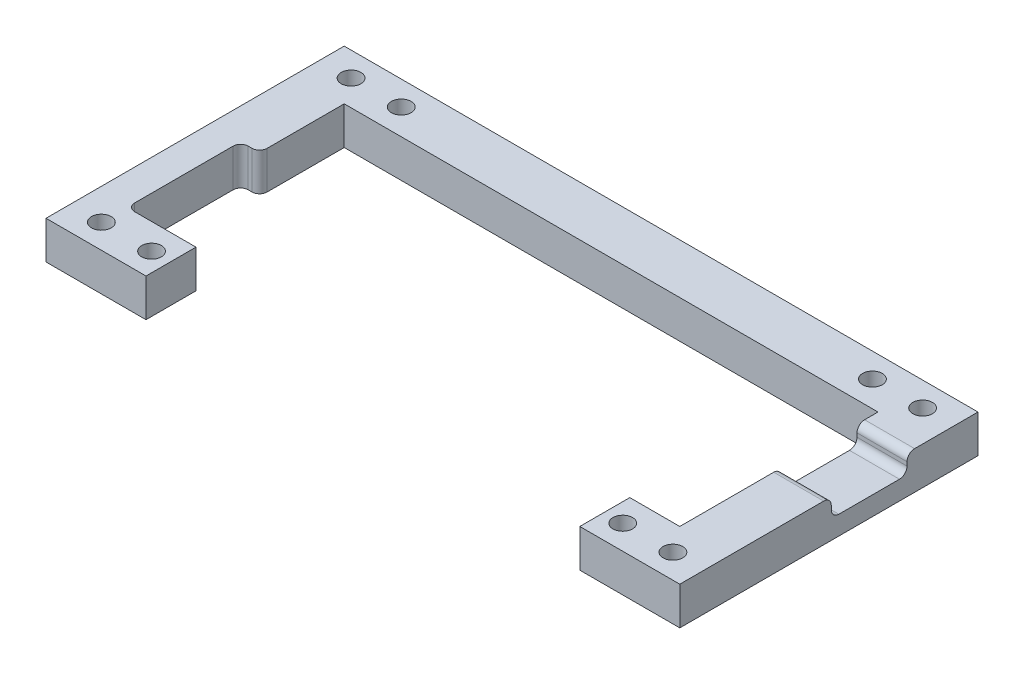
ISO-10303-21;
HEADER;
FILE_DESCRIPTION(('STEP AP214'),'2;1');
FILE_NAME('part.step','',(''),(''),'','','');
FILE_SCHEMA(('AUTOMOTIVE_DESIGN { 1 0 10303 214 1 1 1 1 }'));
ENDSEC;
DATA;
#1=APPLICATION_CONTEXT('core data for automotive mechanical design processes');
#2=APPLICATION_PROTOCOL_DEFINITION('international standard','automotive_design',2000,#1);
#3=PRODUCT_CONTEXT('',#1,'mechanical');
#4=PRODUCT('Part','Part','',(#3));
#5=PRODUCT_RELATED_PRODUCT_CATEGORY('part','',(#4));
#6=PRODUCT_DEFINITION_FORMATION('','',#4);
#7=PRODUCT_DEFINITION_CONTEXT('part definition',#1,'design');
#8=PRODUCT_DEFINITION('design','',#6,#7);
#9=PRODUCT_DEFINITION_SHAPE('','',#8);
#10=(LENGTH_UNIT() NAMED_UNIT(*) SI_UNIT(.MILLI.,.METRE.));
#11=(NAMED_UNIT(*) PLANE_ANGLE_UNIT() SI_UNIT($,.RADIAN.));
#12=(NAMED_UNIT(*) SI_UNIT($,.STERADIAN.) SOLID_ANGLE_UNIT());
#13=UNCERTAINTY_MEASURE_WITH_UNIT(LENGTH_MEASURE(1.E-05),#10,'distance_accuracy_value','');
#14=(GEOMETRIC_REPRESENTATION_CONTEXT(3) GLOBAL_UNCERTAINTY_ASSIGNED_CONTEXT((#13)) GLOBAL_UNIT_ASSIGNED_CONTEXT((#10,
#11,#12)) REPRESENTATION_CONTEXT('',''));
#15=CARTESIAN_POINT('',(0.,0.,0.));
#16=DIRECTION('',(0.,0.,1.));
#17=DIRECTION('',(1.,0.,0.));
#18=AXIS2_PLACEMENT_3D('',#15,#16,#17);
#19=CARTESIAN_POINT('',(173.037829353698,6.35,0.));
#20=DIRECTION('',(1.,0.,0.));
#21=DIRECTION('',(0.,0.,-1.));
#22=AXIS2_PLACEMENT_3D('',#19,#20,#21);
#23=PLANE('',#22);
#24=DIRECTION('',(0.,0.,1.));
#25=VECTOR('',#24,1.);
#26=CARTESIAN_POINT('',(173.037829353698,6.35,0.));
#27=LINE('',#26,#25);
#28=CARTESIAN_POINT('',(173.037829353698,6.35,-36.1278965517242));
#29=VERTEX_POINT('',#28);
#30=CARTESIAN_POINT('',(173.037829353698,6.35,-20.3798965517242));
#31=VERTEX_POINT('',#30);
#32=EDGE_CURVE('E348',#29,#31,#27,.T.);
#33=ORIENTED_EDGE('',*,*,#32,.F.);
#34=CARTESIAN_POINT('',(173.037829353698,5.08,-36.1278965517242));
#35=DIRECTION('',(1.,0.,0.));
#36=DIRECTION('',(0.,0.,-1.));
#37=AXIS2_PLACEMENT_3D('',#34,#35,#36);
#38=CIRCLE('',#37,1.27);
#39=CARTESIAN_POINT('',(173.037829353698,5.08,-37.3978965517242));
#40=VERTEX_POINT('',#39);
#41=EDGE_CURVE('E251',#29,#40,#38,.F.);
#42=ORIENTED_EDGE('',*,*,#41,.T.);
#43=DIRECTION('',(0.,-1.,0.));
#44=VECTOR('',#43,1.);
#45=CARTESIAN_POINT('',(173.037829353698,6.35,-37.3978965517242));
#46=LINE('',#45,#44);
#47=CARTESIAN_POINT('',(173.037829353698,4.445,-37.3978965517242));
#48=VERTEX_POINT('',#47);
#49=EDGE_CURVE('E329',#40,#48,#46,.T.);
#50=ORIENTED_EDGE('',*,*,#49,.T.);
#51=CARTESIAN_POINT('',(173.037829353698,4.445,-38.6678965517242));
#52=DIRECTION('',(1.,0.,0.));
#53=DIRECTION('',(0.,0.,-1.));
#54=AXIS2_PLACEMENT_3D('',#51,#52,#53);
#55=CIRCLE('',#54,1.27);
#56=CARTESIAN_POINT('',(173.037829353698,3.175,-38.6678965517242));
#57=VERTEX_POINT('',#56);
#58=EDGE_CURVE('E263',#48,#57,#55,.T.);
#59=ORIENTED_EDGE('',*,*,#58,.T.);
#60=DIRECTION('',(0.,0.,-1.));
#61=VECTOR('',#60,1.);
#62=CARTESIAN_POINT('',(173.037829353698,3.175,0.));
#63=LINE('',#62,#61);
#64=CARTESIAN_POINT('',(173.037829353698,3.175,-48.8278965517242));
#65=VERTEX_POINT('',#64);
#66=EDGE_CURVE('E335',#57,#65,#63,.T.);
#67=ORIENTED_EDGE('',*,*,#66,.T.);
#68=CARTESIAN_POINT('',(173.037829353698,4.445,-48.8278965517242));
#69=DIRECTION('',(1.,0.,0.));
#70=DIRECTION('',(0.,0.,-1.));
#71=AXIS2_PLACEMENT_3D('',#68,#69,#70);
#72=CIRCLE('',#71,1.27);
#73=CARTESIAN_POINT('',(173.037829353698,4.445,-50.0978965517242));
#74=VERTEX_POINT('',#73);
#75=EDGE_CURVE('E267',#65,#74,#72,.T.);
#76=ORIENTED_EDGE('',*,*,#75,.T.);
#77=DIRECTION('',(0.,-1.,0.));
#78=VECTOR('',#77,1.);
#79=CARTESIAN_POINT('',(173.037829353698,6.35,-50.0978965517242));
#80=LINE('',#79,#78);
#81=CARTESIAN_POINT('',(173.037829353698,5.08,-50.0978965517242));
#82=VERTEX_POINT('',#81);
#83=EDGE_CURVE('E332',#82,#74,#80,.T.);
#84=ORIENTED_EDGE('',*,*,#83,.F.);
#85=CARTESIAN_POINT('',(173.037829353698,5.08,-51.3678965517242));
#86=DIRECTION('',(1.,0.,0.));
#87=DIRECTION('',(0.,0.,-1.));
#88=AXIS2_PLACEMENT_3D('',#85,#86,#87);
#89=CIRCLE('',#88,1.27);
#90=CARTESIAN_POINT('',(173.037829353698,6.35,-51.3678965517242));
#91=VERTEX_POINT('',#90);
#92=EDGE_CURVE('E249',#82,#91,#89,.F.);
#93=ORIENTED_EDGE('',*,*,#92,.T.);
#94=CARTESIAN_POINT('',(173.037829353698,6.35,-53.6158965517242));
#95=VERTEX_POINT('',#94);
#96=EDGE_CURVE('E349',#95,#91,#27,.T.);
#97=ORIENTED_EDGE('',*,*,#96,.F.);
#98=DIRECTION('',(0.,-1.,0.));
#99=VECTOR('',#98,1.);
#100=CARTESIAN_POINT('',(173.037829353698,6.35,-53.6158965517242));
#101=LINE('',#100,#99);
#102=CARTESIAN_POINT('',(173.037829353698,0.,-53.6158965517242));
#103=VERTEX_POINT('',#102);
#104=EDGE_CURVE('E456',#95,#103,#101,.T.);
#105=ORIENTED_EDGE('',*,*,#104,.T.);
#106=DIRECTION('',(0.,0.,1.));
#107=VECTOR('',#106,1.);
#108=CARTESIAN_POINT('',(173.037829353698,0.,0.));
#109=LINE('',#108,#107);
#110=CARTESIAN_POINT('',(173.037829353698,0.,-20.3798965517242));
#111=VERTEX_POINT('',#110);
#112=EDGE_CURVE('E402',#103,#111,#109,.T.);
#113=ORIENTED_EDGE('',*,*,#112,.T.);
#114=DIRECTION('',(0.,-1.,0.));
#115=VECTOR('',#114,1.);
#116=CARTESIAN_POINT('',(173.037829353698,6.35,-20.3798965517242));
#117=LINE('',#116,#115);
#118=EDGE_CURVE('E453',#31,#111,#117,.T.);
#119=ORIENTED_EDGE('',*,*,#118,.F.);
#120=EDGE_LOOP('',(#33,#42,#50,#59,#67,#76,#84,#93,#97,#105,#113,#119));
#121=FACE_BOUND('',#120,.T.);
#122=ADVANCED_FACE('F35',(#121),#23,.F.);
#123=CARTESIAN_POINT('',(181.419829353698,6.35,-3.02124707508063E-13));
#124=DIRECTION('',(1.,0.,0.));
#125=DIRECTION('',(0.,0.,-1.));
#126=AXIS2_PLACEMENT_3D('',#123,#124,#125);
#127=PLANE('',#126);
#128=DIRECTION('',(0.,-1.,0.));
#129=VECTOR('',#128,1.);
#130=CARTESIAN_POINT('',(181.419829353698,6.35,-37.3978965517242));
#131=LINE('',#130,#129);
#132=CARTESIAN_POINT('',(181.419829353698,5.08,-37.3978965517242));
#133=VERTEX_POINT('',#132);
#134=CARTESIAN_POINT('',(181.419829353698,4.445,-37.3978965517242));
#135=VERTEX_POINT('',#134);
#136=EDGE_CURVE('E326',#133,#135,#131,.T.);
#137=ORIENTED_EDGE('',*,*,#136,.F.);
#138=CARTESIAN_POINT('',(181.419829353698,5.08,-36.1278965517242));
#139=DIRECTION('',(1.,0.,0.));
#140=DIRECTION('',(0.,0.,-1.));
#141=AXIS2_PLACEMENT_3D('',#138,#139,#140);
#142=CIRCLE('',#141,1.27);
#143=CARTESIAN_POINT('',(181.419829353698,6.35,-36.1278965517242));
#144=VERTEX_POINT('',#143);
#145=EDGE_CURVE('E245',#133,#144,#142,.T.);
#146=ORIENTED_EDGE('',*,*,#145,.T.);
#147=DIRECTION('',(0.,0.,1.));
#148=VECTOR('',#147,1.);
#149=CARTESIAN_POINT('',(181.419829353698,6.35,-3.02124707508063E-13));
#150=LINE('',#149,#148);
#151=CARTESIAN_POINT('',(181.419829353698,6.35,-11.9978965517242));
#152=VERTEX_POINT('',#151);
#153=EDGE_CURVE('E360',#144,#152,#150,.T.);
#154=ORIENTED_EDGE('',*,*,#153,.T.);
#155=DIRECTION('',(0.,-1.,0.));
#156=VECTOR('',#155,1.);
#157=CARTESIAN_POINT('',(181.419829353698,6.35,-11.9978965517242));
#158=LINE('',#157,#156);
#159=CARTESIAN_POINT('',(181.419829353698,0.,-11.9978965517242));
#160=VERTEX_POINT('',#159);
#161=EDGE_CURVE('E447',#152,#160,#158,.T.);
#162=ORIENTED_EDGE('',*,*,#161,.T.);
#163=DIRECTION('',(0.,0.,1.));
#164=VECTOR('',#163,1.);
#165=CARTESIAN_POINT('',(181.419829353698,0.,-3.02124707508063E-13));
#166=LINE('',#165,#164);
#167=CARTESIAN_POINT('',(181.419829353698,0.,-61.9978965517242));
#168=VERTEX_POINT('',#167);
#169=EDGE_CURVE('E413',#168,#160,#166,.T.);
#170=ORIENTED_EDGE('',*,*,#169,.F.);
#171=DIRECTION('',(0.,-1.,0.));
#172=VECTOR('',#171,1.);
#173=CARTESIAN_POINT('',(181.419829353698,6.35,-61.9978965517242));
#174=LINE('',#173,#172);
#175=CARTESIAN_POINT('',(181.419829353698,6.35,-61.9978965517242));
#176=VERTEX_POINT('',#175);
#177=EDGE_CURVE('E445',#176,#168,#174,.T.);
#178=ORIENTED_EDGE('',*,*,#177,.F.);
#179=CARTESIAN_POINT('',(181.419829353698,6.35,-51.3678965517242));
#180=VERTEX_POINT('',#179);
#181=EDGE_CURVE('E361',#176,#180,#150,.T.);
#182=ORIENTED_EDGE('',*,*,#181,.T.);
#183=CARTESIAN_POINT('',(181.419829353698,5.08,-51.3678965517242));
#184=DIRECTION('',(1.,0.,0.));
#185=DIRECTION('',(0.,0.,-1.));
#186=AXIS2_PLACEMENT_3D('',#183,#184,#185);
#187=CIRCLE('',#186,1.27);
#188=CARTESIAN_POINT('',(181.419829353698,5.08,-50.0978965517242));
#189=VERTEX_POINT('',#188);
#190=EDGE_CURVE('E243',#180,#189,#187,.T.);
#191=ORIENTED_EDGE('',*,*,#190,.T.);
#192=DIRECTION('',(0.,-1.,0.));
#193=VECTOR('',#192,1.);
#194=CARTESIAN_POINT('',(181.419829353698,6.35,-50.0978965517242));
#195=LINE('',#194,#193);
#196=CARTESIAN_POINT('',(181.419829353698,4.445,-50.0978965517242));
#197=VERTEX_POINT('',#196);
#198=EDGE_CURVE('E316',#189,#197,#195,.T.);
#199=ORIENTED_EDGE('',*,*,#198,.T.);
#200=CARTESIAN_POINT('',(181.419829353698,4.445,-48.8278965517242));
#201=DIRECTION('',(1.,0.,0.));
#202=DIRECTION('',(0.,0.,-1.));
#203=AXIS2_PLACEMENT_3D('',#200,#201,#202);
#204=CIRCLE('',#203,1.27);
#205=CARTESIAN_POINT('',(181.419829353698,3.175,-48.8278965517242));
#206=VERTEX_POINT('',#205);
#207=EDGE_CURVE('E265',#197,#206,#204,.F.);
#208=ORIENTED_EDGE('',*,*,#207,.T.);
#209=DIRECTION('',(0.,0.,-1.));
#210=VECTOR('',#209,1.);
#211=CARTESIAN_POINT('',(181.419829353698,3.175,-37.3978965517242));
#212=LINE('',#211,#210);
#213=CARTESIAN_POINT('',(181.419829353698,3.175,-38.6678965517242));
#214=VERTEX_POINT('',#213);
#215=EDGE_CURVE('E319',#214,#206,#212,.T.);
#216=ORIENTED_EDGE('',*,*,#215,.F.);
#217=CARTESIAN_POINT('',(181.419829353698,4.445,-38.6678965517242));
#218=DIRECTION('',(1.,0.,0.));
#219=DIRECTION('',(0.,0.,-1.));
#220=AXIS2_PLACEMENT_3D('',#217,#218,#219);
#221=CIRCLE('',#220,1.27);
#222=EDGE_CURVE('E261',#214,#135,#221,.F.);
#223=ORIENTED_EDGE('',*,*,#222,.T.);
#224=EDGE_LOOP('',(#137,#146,#154,#162,#170,#178,#182,#191,#199,#208,#216,#223));
#225=FACE_BOUND('',#224,.T.);
#226=ADVANCED_FACE('F491',(#225),#127,.T.);
#227=CARTESIAN_POINT('',(0.,6.35,0.));
#228=DIRECTION('',(0.,1.,0.));
#229=DIRECTION('',(0.,0.,1.));
#230=AXIS2_PLACEMENT_3D('',#227,#228,#229);
#231=PLANE('',#230);
#232=DIRECTION('',(-1.,0.,0.));
#233=VECTOR('',#232,1.);
#234=CARTESIAN_POINT('',(83.537177047282,6.35,-39.4298965517241));
#235=LINE('',#234,#233);
#236=CARTESIAN_POINT('',(82.267177047282,6.35,-39.4298965517241));
#237=VERTEX_POINT('',#236);
#238=CARTESIAN_POINT('',(81.632177047282,6.35,-39.4298965517241));
#239=VERTEX_POINT('',#238);
#240=EDGE_CURVE('E291',#237,#239,#235,.T.);
#241=ORIENTED_EDGE('',*,*,#240,.F.);
#242=CARTESIAN_POINT('',(82.267177047282,6.35,-40.6998965517241));
#243=DIRECTION('',(0.,1.,0.));
#244=DIRECTION('',(0.,0.,1.));
#245=AXIS2_PLACEMENT_3D('',#242,#243,#244);
#246=CIRCLE('',#245,1.27);
#247=CARTESIAN_POINT('',(83.537177047282,6.35,-40.6998965517241));
#248=VERTEX_POINT('',#247);
#249=EDGE_CURVE('E58',#237,#248,#246,.T.);
#250=ORIENTED_EDGE('',*,*,#249,.T.);
#251=DIRECTION('',(0.,0.,-1.));
#252=VECTOR('',#251,1.);
#253=CARTESIAN_POINT('',(83.537177047282,6.35,0.));
#254=LINE('',#253,#252);
#255=CARTESIAN_POINT('',(83.537177047282,6.35,-53.6158965517241));
#256=VERTEX_POINT('',#255);
#257=EDGE_CURVE('E343',#248,#256,#254,.T.);
#258=ORIENTED_EDGE('',*,*,#257,.T.);
#259=DIRECTION('',(-1.,0.,0.));
#260=VECTOR('',#259,1.);
#261=CARTESIAN_POINT('',(0.,6.35,-53.6158965517241));
#262=LINE('',#261,#260);
#263=EDGE_CURVE('E345',#95,#256,#262,.T.);
#264=ORIENTED_EDGE('',*,*,#263,.F.);
#265=ORIENTED_EDGE('',*,*,#96,.T.);
#266=DIRECTION('',(1.,0.,0.));
#267=VECTOR('',#266,1.);
#268=CARTESIAN_POINT('',(0.,6.35,-51.3678965517239));
#269=LINE('',#268,#267);
#270=EDGE_CURVE('E253',#91,#180,#269,.T.);
#271=ORIENTED_EDGE('',*,*,#270,.T.);
#272=ORIENTED_EDGE('',*,*,#181,.F.);
#273=DIRECTION('',(1.,0.,0.));
#274=VECTOR('',#273,1.);
#275=CARTESIAN_POINT('',(0.,6.35,-61.9978965517241));
#276=LINE('',#275,#274);
#277=CARTESIAN_POINT('',(75.155177047282,6.35,-61.9978965517241));
#278=VERTEX_POINT('',#277);
#279=EDGE_CURVE('E364',#278,#176,#276,.T.);
#280=ORIENTED_EDGE('',*,*,#279,.F.);
#281=DIRECTION('',(0.,0.,-1.));
#282=VECTOR('',#281,1.);
#283=CARTESIAN_POINT('',(75.155177047282,6.35,0.));
#284=LINE('',#283,#282);
#285=CARTESIAN_POINT('',(75.155177047282,6.35,-11.9978965517241));
#286=VERTEX_POINT('',#285);
#287=EDGE_CURVE('E221',#286,#278,#284,.T.);
#288=ORIENTED_EDGE('',*,*,#287,.F.);
#289=DIRECTION('',(1.,0.,0.));
#290=VECTOR('',#289,1.);
#291=CARTESIAN_POINT('',(0.,6.35,-11.9978965517241));
#292=LINE('',#291,#290);
#293=CARTESIAN_POINT('',(91.919177047282,6.35,-11.9978965517241));
#294=VERTEX_POINT('',#293);
#295=EDGE_CURVE('E213',#286,#294,#292,.T.);
#296=ORIENTED_EDGE('',*,*,#295,.T.);
#297=DIRECTION('',(0.,0.,-1.));
#298=VECTOR('',#297,1.);
#299=CARTESIAN_POINT('',(91.919177047282,6.35,0.));
#300=LINE('',#299,#298);
#301=CARTESIAN_POINT('',(91.919177047282,6.35,-20.3798965517241));
#302=VERTEX_POINT('',#301);
#303=EDGE_CURVE('E202',#294,#302,#300,.T.);
#304=ORIENTED_EDGE('',*,*,#303,.T.);
#305=DIRECTION('',(1.,0.,0.));
#306=VECTOR('',#305,1.);
#307=CARTESIAN_POINT('',(0.,6.35,-20.3798965517241));
#308=LINE('',#307,#306);
#309=CARTESIAN_POINT('',(81.632177047282,6.35,-20.3798965517241));
#310=VERTEX_POINT('',#309);
#311=EDGE_CURVE('E212',#310,#302,#308,.T.);
#312=ORIENTED_EDGE('',*,*,#311,.F.);
#313=CARTESIAN_POINT('',(81.632177047282,6.35,-21.6498965517241));
#314=DIRECTION('',(0.,1.,0.));
#315=DIRECTION('',(0.,0.,1.));
#316=AXIS2_PLACEMENT_3D('',#313,#314,#315);
#317=CIRCLE('',#316,1.27);
#318=CARTESIAN_POINT('',(80.362177047282,6.35,-21.6498965517241));
#319=VERTEX_POINT('',#318);
#320=EDGE_CURVE('E286',#310,#319,#317,.F.);
#321=ORIENTED_EDGE('',*,*,#320,.T.);
#322=DIRECTION('',(0.,0.,1.));
#323=VECTOR('',#322,1.);
#324=CARTESIAN_POINT('',(80.362177047282,6.35,-20.3798965517241));
#325=LINE('',#324,#323);
#326=CARTESIAN_POINT('',(80.362177047282,6.35,-38.1598965517241));
#327=VERTEX_POINT('',#326);
#328=EDGE_CURVE('E293',#327,#319,#325,.T.);
#329=ORIENTED_EDGE('',*,*,#328,.F.);
#330=CARTESIAN_POINT('',(81.632177047282,6.35,-38.1598965517241));
#331=DIRECTION('',(0.,1.,0.));
#332=DIRECTION('',(0.,0.,1.));
#333=AXIS2_PLACEMENT_3D('',#330,#331,#332);
#334=CIRCLE('',#333,1.27);
#335=EDGE_CURVE('E43',#327,#239,#334,.F.);
#336=ORIENTED_EDGE('',*,*,#335,.T.);
#337=EDGE_LOOP('',(#241,#250,#258,#264,#265,#271,#272,#280,#288,#296,#304,#312,#321,#329,#336));
#338=FACE_BOUND('',#337,.T.);
#339=CARTESIAN_POINT('',(176.20282520049,6.35,-57.9310082298693));
#340=DIRECTION('',(0.,1.,0.));
#341=DIRECTION('',(0.,0.,1.));
#342=AXIS2_PLACEMENT_3D('',#339,#340,#341);
#343=CIRCLE('',#342,1.65100000000002);
#344=CARTESIAN_POINT('',(176.20282520049,6.35,-56.2800082298693));
#345=VERTEX_POINT('',#344);
#346=EDGE_CURVE('E383',#345,#345,#343,.F.);
#347=ORIENTED_EDGE('',*,*,#346,.T.);
#348=EDGE_LOOP('',(#347));
#349=FACE_BOUND('',#348,.T.);
#350=CARTESIAN_POINT('',(88.7874552004898,6.35,-16.0647848735786));
#351=DIRECTION('',(0.,1.,0.));
#352=DIRECTION('',(0.,0.,1.));
#353=AXIS2_PLACEMENT_3D('',#350,#351,#352);
#354=CIRCLE('',#353,1.65100000000001);
#355=CARTESIAN_POINT('',(88.7874552004898,6.35,-14.4137848735786));
#356=VERTEX_POINT('',#355);
#357=EDGE_CURVE('E377',#356,#356,#354,.T.);
#358=ORIENTED_EDGE('',*,*,#357,.F.);
#359=EDGE_LOOP('',(#358));
#360=FACE_BOUND('',#359,.T.);
#361=CARTESIAN_POINT('',(88.7874552004898,6.35,-57.9310082298697));
#362=DIRECTION('',(0.,1.,0.));
#363=DIRECTION('',(0.,0.,1.));
#364=AXIS2_PLACEMENT_3D('',#361,#362,#363);
#365=CIRCLE('',#364,1.65100000000001);
#366=CARTESIAN_POINT('',(88.7874552004898,6.35,-56.2800082298697));
#367=VERTEX_POINT('',#366);
#368=EDGE_CURVE('E374',#367,#367,#365,.F.);
#369=ORIENTED_EDGE('',*,*,#368,.T.);
#370=EDGE_LOOP('',(#369));
#371=FACE_BOUND('',#370,.T.);
#372=CARTESIAN_POINT('',(167.78755120049,6.35,-57.9310082298691));
#373=DIRECTION('',(0.,1.,0.));
#374=DIRECTION('',(0.,0.,1.));
#375=AXIS2_PLACEMENT_3D('',#372,#373,#374);
#376=CIRCLE('',#375,1.65100000000002);
#377=CARTESIAN_POINT('',(167.78755120049,6.35,-56.2800082298691));
#378=VERTEX_POINT('',#377);
#379=EDGE_CURVE('E371',#378,#378,#376,.T.);
#380=ORIENTED_EDGE('',*,*,#379,.F.);
#381=EDGE_LOOP('',(#380));
#382=FACE_BOUND('',#381,.T.);
#383=CARTESIAN_POINT('',(80.3721812004898,6.35,-16.0647848735792));
#384=DIRECTION('',(0.,1.,0.));
#385=DIRECTION('',(0.,0.,1.));
#386=AXIS2_PLACEMENT_3D('',#383,#384,#385);
#387=CIRCLE('',#386,1.65100000000001);
#388=CARTESIAN_POINT('',(80.3721812004898,6.35,-14.4137848735792));
#389=VERTEX_POINT('',#388);
#390=EDGE_CURVE('E368',#389,#389,#387,.F.);
#391=ORIENTED_EDGE('',*,*,#390,.T.);
#392=EDGE_LOOP('',(#391));
#393=FACE_BOUND('',#392,.T.);
#394=CARTESIAN_POINT('',(80.3721812004898,6.35,-57.9310082298691));
#395=DIRECTION('',(0.,1.,0.));
#396=DIRECTION('',(0.,0.,1.));
#397=AXIS2_PLACEMENT_3D('',#394,#395,#396);
#398=CIRCLE('',#397,1.65100000000001);
#399=CARTESIAN_POINT('',(80.3721812004898,6.35,-56.2800082298691));
#400=VERTEX_POINT('',#399);
#401=EDGE_CURVE('E223',#400,#400,#398,.T.);
#402=ORIENTED_EDGE('',*,*,#401,.F.);
#403=EDGE_LOOP('',(#402));
#404=FACE_BOUND('',#403,.T.);
#405=ADVANCED_FACE('F217',(#338,#349,#360,#371,#382,#393,#404),#231,.T.);
#406=CARTESIAN_POINT('',(0.,6.35,-11.9978965517241));
#407=DIRECTION('',(0.,0.,-1.));
#408=DIRECTION('',(-1.,0.,0.));
#409=AXIS2_PLACEMENT_3D('',#406,#407,#408);
#410=PLANE('',#409);
#411=DIRECTION('',(1.,0.,0.));
#412=VECTOR('',#411,1.);
#413=CARTESIAN_POINT('',(0.,0.,-11.9978965517241));
#414=LINE('',#413,#412);
#415=CARTESIAN_POINT('',(75.155177047282,0.,-11.9978965517241));
#416=VERTEX_POINT('',#415);
#417=CARTESIAN_POINT('',(91.919177047282,0.,-11.9978965517241));
#418=VERTEX_POINT('',#417);
#419=EDGE_CURVE('E227',#416,#418,#414,.T.);
#420=ORIENTED_EDGE('',*,*,#419,.T.);
#421=DIRECTION('',(0.,-1.,0.));
#422=VECTOR('',#421,1.);
#423=CARTESIAN_POINT('',(91.919177047282,6.35,-11.9978965517241));
#424=LINE('',#423,#422);
#425=EDGE_CURVE('E207',#294,#418,#424,.T.);
#426=ORIENTED_EDGE('',*,*,#425,.F.);
#427=ORIENTED_EDGE('',*,*,#295,.F.);
#428=DIRECTION('',(0.,-1.,0.));
#429=VECTOR('',#428,1.);
#430=CARTESIAN_POINT('',(75.155177047282,6.35,-11.9978965517241));
#431=LINE('',#430,#429);
#432=EDGE_CURVE('E389',#286,#416,#431,.T.);
#433=ORIENTED_EDGE('',*,*,#432,.T.);
#434=EDGE_LOOP('',(#420,#426,#427,#433));
#435=FACE_BOUND('',#434,.T.);
#436=ADVANCED_FACE('F225',(#435),#410,.F.);
#437=CARTESIAN_POINT('',(91.919177047282,6.35,0.));
#438=DIRECTION('',(-1.,0.,0.));
#439=DIRECTION('',(0.,0.,1.));
#440=AXIS2_PLACEMENT_3D('',#437,#438,#439);
#441=PLANE('',#440);
#442=DIRECTION('',(0.,0.,-1.));
#443=VECTOR('',#442,1.);
#444=CARTESIAN_POINT('',(91.919177047282,0.,0.));
#445=LINE('',#444,#443);
#446=CARTESIAN_POINT('',(91.919177047282,0.,-20.3798965517241));
#447=VERTEX_POINT('',#446);
#448=EDGE_CURVE('E393',#418,#447,#445,.T.);
#449=ORIENTED_EDGE('',*,*,#448,.T.);
#450=DIRECTION('',(0.,-1.,0.));
#451=VECTOR('',#450,1.);
#452=CARTESIAN_POINT('',(91.919177047282,6.35,-20.3798965517241));
#453=LINE('',#452,#451);
#454=EDGE_CURVE('E210',#302,#447,#453,.T.);
#455=ORIENTED_EDGE('',*,*,#454,.F.);
#456=ORIENTED_EDGE('',*,*,#303,.F.);
#457=ORIENTED_EDGE('',*,*,#425,.T.);
#458=EDGE_LOOP('',(#449,#455,#456,#457));
#459=FACE_BOUND('',#458,.T.);
#460=ADVANCED_FACE('F205',(#459),#441,.F.);
#461=CARTESIAN_POINT('',(0.,6.35,-20.3798965517241));
#462=DIRECTION('',(0.,0.,-1.));
#463=DIRECTION('',(-1.,0.,0.));
#464=AXIS2_PLACEMENT_3D('',#461,#462,#463);
#465=PLANE('',#464);
#466=DIRECTION('',(1.,0.,0.));
#467=VECTOR('',#466,1.);
#468=CARTESIAN_POINT('',(0.,0.,-20.3798965517241));
#469=LINE('',#468,#467);
#470=CARTESIAN_POINT('',(81.632177047282,0.,-20.3798965517241));
#471=VERTEX_POINT('',#470);
#472=EDGE_CURVE('E395',#471,#447,#469,.T.);
#473=ORIENTED_EDGE('',*,*,#472,.F.);
#474=DIRECTION('',(0.,1.,0.));
#475=VECTOR('',#474,1.);
#476=CARTESIAN_POINT('',(81.632177047282,6.35,-20.3798965517241));
#477=LINE('',#476,#475);
#478=EDGE_CURVE('E269',#471,#310,#477,.T.);
#479=ORIENTED_EDGE('',*,*,#478,.T.);
#480=ORIENTED_EDGE('',*,*,#311,.T.);
#481=ORIENTED_EDGE('',*,*,#454,.T.);
#482=EDGE_LOOP('',(#473,#479,#480,#481));
#483=FACE_BOUND('',#482,.T.);
#484=ADVANCED_FACE('F535',(#483),#465,.T.);
#485=CARTESIAN_POINT('',(83.537177047282,6.35,0.));
#486=DIRECTION('',(-1.,0.,0.));
#487=DIRECTION('',(0.,0.,1.));
#488=AXIS2_PLACEMENT_3D('',#485,#486,#487);
#489=PLANE('',#488);
#490=ORIENTED_EDGE('',*,*,#257,.F.);
#491=DIRECTION('',(0.,1.,0.));
#492=VECTOR('',#491,1.);
#493=CARTESIAN_POINT('',(83.537177047282,6.35,-40.6998965517241));
#494=LINE('',#493,#492);
#495=CARTESIAN_POINT('',(83.537177047282,0.,-40.6998965517241));
#496=VERTEX_POINT('',#495);
#497=EDGE_CURVE('E50',#248,#496,#494,.F.);
#498=ORIENTED_EDGE('',*,*,#497,.T.);
#499=DIRECTION('',(0.,0.,-1.));
#500=VECTOR('',#499,1.);
#501=CARTESIAN_POINT('',(83.537177047282,0.,0.));
#502=LINE('',#501,#500);
#503=CARTESIAN_POINT('',(83.537177047282,0.,-53.6158965517241));
#504=VERTEX_POINT('',#503);
#505=EDGE_CURVE('E397',#496,#504,#502,.T.);
#506=ORIENTED_EDGE('',*,*,#505,.T.);
#507=DIRECTION('',(0.,-1.,0.));
#508=VECTOR('',#507,1.);
#509=CARTESIAN_POINT('',(83.537177047282,6.35,-53.6158965517241));
#510=LINE('',#509,#508);
#511=EDGE_CURVE('E232',#256,#504,#510,.T.);
#512=ORIENTED_EDGE('',*,*,#511,.F.);
#513=EDGE_LOOP('',(#490,#498,#506,#512));
#514=FACE_BOUND('',#513,.T.);
#515=ADVANCED_FACE('F515',(#514),#489,.F.);
#516=CARTESIAN_POINT('',(0.,6.35,-53.6158965517241));
#517=DIRECTION('',(0.,0.,1.));
#518=DIRECTION('',(1.,0.,0.));
#519=AXIS2_PLACEMENT_3D('',#516,#517,#518);
#520=PLANE('',#519);
#521=DIRECTION('',(-1.,0.,0.));
#522=VECTOR('',#521,1.);
#523=CARTESIAN_POINT('',(0.,0.,-53.6158965517241));
#524=LINE('',#523,#522);
#525=EDGE_CURVE('E399',#103,#504,#524,.T.);
#526=ORIENTED_EDGE('',*,*,#525,.F.);
#527=ORIENTED_EDGE('',*,*,#104,.F.);
#528=ORIENTED_EDGE('',*,*,#263,.T.);
#529=ORIENTED_EDGE('',*,*,#511,.T.);
#530=EDGE_LOOP('',(#526,#527,#528,#529));
#531=FACE_BOUND('',#530,.T.);
#532=ADVANCED_FACE('F461',(#531),#520,.T.);
#533=CARTESIAN_POINT('',(0.,6.35,-20.3798965517242));
#534=DIRECTION('',(0.,0.,1.));
#535=DIRECTION('',(1.,0.,0.));
#536=AXIS2_PLACEMENT_3D('',#533,#534,#535);
#537=PLANE('',#536);
#538=DIRECTION('',(-1.,0.,0.));
#539=VECTOR('',#538,1.);
#540=CARTESIAN_POINT('',(0.,0.,-20.3798965517242));
#541=LINE('',#540,#539);
#542=CARTESIAN_POINT('',(164.655829353698,0.,-20.3798965517242));
#543=VERTEX_POINT('',#542);
#544=EDGE_CURVE('E404',#111,#543,#541,.T.);
#545=ORIENTED_EDGE('',*,*,#544,.T.);
#546=DIRECTION('',(0.,-1.,0.));
#547=VECTOR('',#546,1.);
#548=CARTESIAN_POINT('',(164.655829353698,6.35,-20.3798965517242));
#549=LINE('',#548,#547);
#550=CARTESIAN_POINT('',(164.655829353698,6.35,-20.3798965517242));
#551=VERTEX_POINT('',#550);
#552=EDGE_CURVE('E451',#551,#543,#549,.T.);
#553=ORIENTED_EDGE('',*,*,#552,.F.);
#554=DIRECTION('',(-1.,0.,0.));
#555=VECTOR('',#554,1.);
#556=CARTESIAN_POINT('',(0.,6.35,-20.3798965517242));
#557=LINE('',#556,#555);
#558=EDGE_CURVE('E352',#31,#551,#557,.T.);
#559=ORIENTED_EDGE('',*,*,#558,.F.);
#560=ORIENTED_EDGE('',*,*,#118,.T.);
#561=EDGE_LOOP('',(#545,#553,#559,#560));
#562=FACE_BOUND('',#561,.T.);
#563=ADVANCED_FACE('F472',(#562),#537,.F.);
#564=CARTESIAN_POINT('',(164.655829353698,6.35,5.45229935836391E-13));
#565=DIRECTION('',(-1.,0.,0.));
#566=DIRECTION('',(0.,0.,1.));
#567=AXIS2_PLACEMENT_3D('',#564,#565,#566);
#568=PLANE('',#567);
#569=DIRECTION('',(0.,0.,-1.));
#570=VECTOR('',#569,1.);
#571=CARTESIAN_POINT('',(164.655829353698,0.,5.45229935836391E-13));
#572=LINE('',#571,#570);
#573=CARTESIAN_POINT('',(164.655829353698,0.,-11.9978965517242));
#574=VERTEX_POINT('',#573);
#575=EDGE_CURVE('E407',#574,#543,#572,.T.);
#576=ORIENTED_EDGE('',*,*,#575,.F.);
#577=DIRECTION('',(0.,-1.,0.));
#578=VECTOR('',#577,1.);
#579=CARTESIAN_POINT('',(164.655829353698,6.35,-11.9978965517242));
#580=LINE('',#579,#578);
#581=CARTESIAN_POINT('',(164.655829353698,6.35,-11.9978965517242));
#582=VERTEX_POINT('',#581);
#583=EDGE_CURVE('E449',#582,#574,#580,.T.);
#584=ORIENTED_EDGE('',*,*,#583,.F.);
#585=DIRECTION('',(0.,0.,-1.));
#586=VECTOR('',#585,1.);
#587=CARTESIAN_POINT('',(164.655829353698,6.35,5.45229935836391E-13));
#588=LINE('',#587,#586);
#589=EDGE_CURVE('E354',#582,#551,#588,.T.);
#590=ORIENTED_EDGE('',*,*,#589,.T.);
#591=ORIENTED_EDGE('',*,*,#552,.T.);
#592=EDGE_LOOP('',(#576,#584,#590,#591));
#593=FACE_BOUND('',#592,.T.);
#594=ADVANCED_FACE('F577',(#593),#568,.T.);
#595=CARTESIAN_POINT('',(0.,6.35,-11.9978965517242));
#596=DIRECTION('',(0.,0.,1.));
#597=DIRECTION('',(1.,0.,0.));
#598=AXIS2_PLACEMENT_3D('',#595,#596,#597);
#599=PLANE('',#598);
#600=DIRECTION('',(-1.,0.,0.));
#601=VECTOR('',#600,1.);
#602=CARTESIAN_POINT('',(0.,0.,-11.9978965517242));
#603=LINE('',#602,#601);
#604=EDGE_CURVE('E410',#160,#574,#603,.T.);
#605=ORIENTED_EDGE('',*,*,#604,.F.);
#606=ORIENTED_EDGE('',*,*,#161,.F.);
#607=DIRECTION('',(-1.,0.,0.));
#608=VECTOR('',#607,1.);
#609=CARTESIAN_POINT('',(0.,6.35,-11.9978965517242));
#610=LINE('',#609,#608);
#611=EDGE_CURVE('E357',#152,#582,#610,.T.);
#612=ORIENTED_EDGE('',*,*,#611,.T.);
#613=ORIENTED_EDGE('',*,*,#583,.T.);
#614=EDGE_LOOP('',(#605,#606,#612,#613));
#615=FACE_BOUND('',#614,.T.);
#616=ADVANCED_FACE('F574',(#615),#599,.T.);
#617=CARTESIAN_POINT('',(0.,6.35,-61.9978965517241));
#618=DIRECTION('',(0.,0.,-1.));
#619=DIRECTION('',(-1.,0.,0.));
#620=AXIS2_PLACEMENT_3D('',#617,#618,#619);
#621=PLANE('',#620);
#622=DIRECTION('',(1.,0.,0.));
#623=VECTOR('',#622,1.);
#624=CARTESIAN_POINT('',(0.,0.,-61.9978965517241));
#625=LINE('',#624,#623);
#626=CARTESIAN_POINT('',(75.155177047282,0.,-61.9978965517241));
#627=VERTEX_POINT('',#626);
#628=EDGE_CURVE('E416',#627,#168,#625,.T.);
#629=ORIENTED_EDGE('',*,*,#628,.F.);
#630=DIRECTION('',(0.,-1.,0.));
#631=VECTOR('',#630,1.);
#632=CARTESIAN_POINT('',(75.155177047282,6.35,-61.9978965517241));
#633=LINE('',#632,#631);
#634=EDGE_CURVE('E443',#278,#627,#633,.T.);
#635=ORIENTED_EDGE('',*,*,#634,.F.);
#636=ORIENTED_EDGE('',*,*,#279,.T.);
#637=ORIENTED_EDGE('',*,*,#177,.T.);
#638=EDGE_LOOP('',(#629,#635,#636,#637));
#639=FACE_BOUND('',#638,.T.);
#640=ADVANCED_FACE('F569',(#639),#621,.T.);
#641=CARTESIAN_POINT('',(176.20282520049,6.35,-57.9310082298693));
#642=DIRECTION('',(0.,-1.,0.));
#643=DIRECTION('',(0.,0.,-1.));
#644=AXIS2_PLACEMENT_3D('',#641,#642,#643);
#645=CYLINDRICAL_SURFACE('',#644,1.65100000000002);
#646=ORIENTED_EDGE('',*,*,#346,.F.);
#647=EDGE_LOOP('',(#646));
#648=FACE_BOUND('',#647,.T.);
#649=CARTESIAN_POINT('',(176.20282520049,0.,-57.9310082298693));
#650=DIRECTION('',(0.,1.,0.));
#651=DIRECTION('',(0.,0.,1.));
#652=AXIS2_PLACEMENT_3D('',#649,#650,#651);
#653=CIRCLE('',#652,1.65100000000002);
#654=CARTESIAN_POINT('',(176.20282520049,0.,-56.2800082298693));
#655=VERTEX_POINT('',#654);
#656=EDGE_CURVE('E437',#655,#655,#653,.F.);
#657=ORIENTED_EDGE('',*,*,#656,.T.);
#658=EDGE_LOOP('',(#657));
#659=FACE_BOUND('',#658,.T.);
#660=ADVANCED_FACE('F587',(#648,#659),#645,.F.);
#661=CARTESIAN_POINT('',(176.20282520049,6.35,-16.0647848735792));
#662=DIRECTION('',(0.,-1.,0.));
#663=DIRECTION('',(0.,0.,-1.));
#664=AXIS2_PLACEMENT_3D('',#661,#662,#663);
#665=CYLINDRICAL_SURFACE('',#664,1.65100000000002);
#666=CARTESIAN_POINT('',(176.20282520049,6.35,-16.0647848735792));
#667=DIRECTION('',(0.,1.,0.));
#668=DIRECTION('',(0.,0.,1.));
#669=AXIS2_PLACEMENT_3D('',#666,#667,#668);
#670=CIRCLE('',#669,1.65100000000002);
#671=CARTESIAN_POINT('',(176.20282520049,6.35,-14.4137848735791));
#672=VERTEX_POINT('',#671);
#673=EDGE_CURVE('E380',#672,#672,#670,.T.);
#674=ORIENTED_EDGE('',*,*,#673,.T.);
#675=EDGE_LOOP('',(#674));
#676=FACE_BOUND('',#675,.T.);
#677=CARTESIAN_POINT('',(176.20282520049,0.,-16.0647848735792));
#678=DIRECTION('',(0.,1.,0.));
#679=DIRECTION('',(0.,0.,1.));
#680=AXIS2_PLACEMENT_3D('',#677,#678,#679);
#681=CIRCLE('',#680,1.65100000000002);
#682=CARTESIAN_POINT('',(176.20282520049,0.,-14.4137848735791));
#683=VERTEX_POINT('',#682);
#684=EDGE_CURVE('E434',#683,#683,#681,.T.);
#685=ORIENTED_EDGE('',*,*,#684,.F.);
#686=EDGE_LOOP('',(#685));
#687=FACE_BOUND('',#686,.T.);
#688=ADVANCED_FACE('F605',(#676,#687),#665,.F.);
#689=CARTESIAN_POINT('',(88.7874552004898,6.35,-16.0647848735786));
#690=DIRECTION('',(0.,-1.,0.));
#691=DIRECTION('',(0.,0.,-1.));
#692=AXIS2_PLACEMENT_3D('',#689,#690,#691);
#693=CYLINDRICAL_SURFACE('',#692,1.65100000000001);
#694=ORIENTED_EDGE('',*,*,#357,.T.);
#695=EDGE_LOOP('',(#694));
#696=FACE_BOUND('',#695,.T.);
#697=CARTESIAN_POINT('',(88.7874552004898,0.,-16.0647848735786));
#698=DIRECTION('',(0.,1.,0.));
#699=DIRECTION('',(0.,0.,1.));
#700=AXIS2_PLACEMENT_3D('',#697,#698,#699);
#701=CIRCLE('',#700,1.65100000000001);
#702=CARTESIAN_POINT('',(88.7874552004898,0.,-14.4137848735786));
#703=VERTEX_POINT('',#702);
#704=EDGE_CURVE('E431',#703,#703,#701,.T.);
#705=ORIENTED_EDGE('',*,*,#704,.F.);
#706=EDGE_LOOP('',(#705));
#707=FACE_BOUND('',#706,.T.);
#708=ADVANCED_FACE('F601',(#696,#707),#693,.F.);
#709=CARTESIAN_POINT('',(88.7874552004898,6.35,-57.9310082298697));
#710=DIRECTION('',(0.,-1.,0.));
#711=DIRECTION('',(0.,0.,-1.));
#712=AXIS2_PLACEMENT_3D('',#709,#710,#711);
#713=CYLINDRICAL_SURFACE('',#712,1.65100000000001);
#714=ORIENTED_EDGE('',*,*,#368,.F.);
#715=EDGE_LOOP('',(#714));
#716=FACE_BOUND('',#715,.T.);
#717=CARTESIAN_POINT('',(88.7874552004898,0.,-57.9310082298697));
#718=DIRECTION('',(0.,1.,0.));
#719=DIRECTION('',(0.,0.,1.));
#720=AXIS2_PLACEMENT_3D('',#717,#718,#719);
#721=CIRCLE('',#720,1.65100000000001);
#722=CARTESIAN_POINT('',(88.7874552004898,0.,-56.2800082298697));
#723=VERTEX_POINT('',#722);
#724=EDGE_CURVE('E428',#723,#723,#721,.F.);
#725=ORIENTED_EDGE('',*,*,#724,.T.);
#726=EDGE_LOOP('',(#725));
#727=FACE_BOUND('',#726,.T.);
#728=ADVANCED_FACE('F597',(#716,#727),#713,.F.);
#729=CARTESIAN_POINT('',(167.78755120049,6.35,-57.9310082298691));
#730=DIRECTION('',(0.,-1.,0.));
#731=DIRECTION('',(0.,0.,-1.));
#732=AXIS2_PLACEMENT_3D('',#729,#730,#731);
#733=CYLINDRICAL_SURFACE('',#732,1.65100000000002);
#734=ORIENTED_EDGE('',*,*,#379,.T.);
#735=EDGE_LOOP('',(#734));
#736=FACE_BOUND('',#735,.T.);
#737=CARTESIAN_POINT('',(167.78755120049,0.,-57.9310082298691));
#738=DIRECTION('',(0.,1.,0.));
#739=DIRECTION('',(0.,0.,1.));
#740=AXIS2_PLACEMENT_3D('',#737,#738,#739);
#741=CIRCLE('',#740,1.65100000000002);
#742=CARTESIAN_POINT('',(167.78755120049,0.,-56.2800082298691));
#743=VERTEX_POINT('',#742);
#744=EDGE_CURVE('E425',#743,#743,#741,.T.);
#745=ORIENTED_EDGE('',*,*,#744,.F.);
#746=EDGE_LOOP('',(#745));
#747=FACE_BOUND('',#746,.T.);
#748=ADVANCED_FACE('F593',(#736,#747),#733,.F.);
#749=CARTESIAN_POINT('',(80.3721812004898,6.35,-16.0647848735792));
#750=DIRECTION('',(0.,-1.,0.));
#751=DIRECTION('',(0.,0.,-1.));
#752=AXIS2_PLACEMENT_3D('',#749,#750,#751);
#753=CYLINDRICAL_SURFACE('',#752,1.65100000000001);
#754=ORIENTED_EDGE('',*,*,#390,.F.);
#755=EDGE_LOOP('',(#754));
#756=FACE_BOUND('',#755,.T.);
#757=CARTESIAN_POINT('',(80.3721812004898,0.,-16.0647848735792));
#758=DIRECTION('',(0.,1.,0.));
#759=DIRECTION('',(0.,0.,1.));
#760=AXIS2_PLACEMENT_3D('',#757,#758,#759);
#761=CIRCLE('',#760,1.65100000000001);
#762=CARTESIAN_POINT('',(80.3721812004898,0.,-14.4137848735792));
#763=VERTEX_POINT('',#762);
#764=EDGE_CURVE('E422',#763,#763,#761,.F.);
#765=ORIENTED_EDGE('',*,*,#764,.T.);
#766=EDGE_LOOP('',(#765));
#767=FACE_BOUND('',#766,.T.);
#768=ADVANCED_FACE('F590',(#756,#767),#753,.F.);
#769=CARTESIAN_POINT('',(75.155177047282,6.35,0.));
#770=DIRECTION('',(-1.,0.,0.));
#771=DIRECTION('',(0.,0.,1.));
#772=AXIS2_PLACEMENT_3D('',#769,#770,#771);
#773=PLANE('',#772);
#774=DIRECTION('',(0.,0.,-1.));
#775=VECTOR('',#774,1.);
#776=CARTESIAN_POINT('',(75.155177047282,0.,0.));
#777=LINE('',#776,#775);
#778=EDGE_CURVE('E419',#416,#627,#777,.T.);
#779=ORIENTED_EDGE('',*,*,#778,.F.);
#780=ORIENTED_EDGE('',*,*,#432,.F.);
#781=ORIENTED_EDGE('',*,*,#287,.T.);
#782=ORIENTED_EDGE('',*,*,#634,.T.);
#783=EDGE_LOOP('',(#779,#780,#781,#782));
#784=FACE_BOUND('',#783,.T.);
#785=ADVANCED_FACE('F547',(#784),#773,.T.);
#786=CARTESIAN_POINT('',(80.3721812004898,6.35,-57.9310082298691));
#787=DIRECTION('',(0.,-1.,0.));
#788=DIRECTION('',(0.,0.,-1.));
#789=AXIS2_PLACEMENT_3D('',#786,#787,#788);
#790=CYLINDRICAL_SURFACE('',#789,1.65100000000001);
#791=ORIENTED_EDGE('',*,*,#401,.T.);
#792=EDGE_LOOP('',(#791));
#793=FACE_BOUND('',#792,.T.);
#794=CARTESIAN_POINT('',(80.3721812004898,0.,-57.9310082298691));
#795=DIRECTION('',(0.,1.,0.));
#796=DIRECTION('',(0.,0.,1.));
#797=AXIS2_PLACEMENT_3D('',#794,#795,#796);
#798=CIRCLE('',#797,1.65100000000001);
#799=CARTESIAN_POINT('',(80.3721812004898,0.,-56.2800082298691));
#800=VERTEX_POINT('',#799);
#801=EDGE_CURVE('E338',#800,#800,#798,.T.);
#802=ORIENTED_EDGE('',*,*,#801,.F.);
#803=EDGE_LOOP('',(#802));
#804=FACE_BOUND('',#803,.T.);
#805=ADVANCED_FACE('F543',(#793,#804),#790,.F.);
#806=CARTESIAN_POINT('',(167.78755120049,6.35,-16.0647848735792));
#807=DIRECTION('',(0.,-1.,0.));
#808=DIRECTION('',(0.,0.,-1.));
#809=AXIS2_PLACEMENT_3D('',#806,#807,#808);
#810=CYLINDRICAL_SURFACE('',#809,1.65100000000002);
#811=CARTESIAN_POINT('',(167.78755120049,6.35,-16.0647848735792));
#812=DIRECTION('',(0.,1.,0.));
#813=DIRECTION('',(0.,0.,1.));
#814=AXIS2_PLACEMENT_3D('',#811,#812,#813);
#815=CIRCLE('',#814,1.65100000000002);
#816=CARTESIAN_POINT('',(167.78755120049,6.35,-14.4137848735791));
#817=VERTEX_POINT('',#816);
#818=EDGE_CURVE('E386',#817,#817,#815,.F.);
#819=ORIENTED_EDGE('',*,*,#818,.F.);
#820=EDGE_LOOP('',(#819));
#821=FACE_BOUND('',#820,.T.);
#822=CARTESIAN_POINT('',(167.78755120049,0.,-16.0647848735792));
#823=DIRECTION('',(0.,1.,0.));
#824=DIRECTION('',(0.,0.,1.));
#825=AXIS2_PLACEMENT_3D('',#822,#823,#824);
#826=CIRCLE('',#825,1.65100000000002);
#827=CARTESIAN_POINT('',(167.78755120049,0.,-14.4137848735791));
#828=VERTEX_POINT('',#827);
#829=EDGE_CURVE('E340',#828,#828,#826,.F.);
#830=ORIENTED_EDGE('',*,*,#829,.T.);
#831=EDGE_LOOP('',(#830));
#832=FACE_BOUND('',#831,.T.);
#833=ADVANCED_FACE('F546',(#821,#832),#810,.F.);
#834=ORIENTED_EDGE('',*,*,#153,.F.);
#835=DIRECTION('',(1.,0.,0.));
#836=VECTOR('',#835,1.);
#837=CARTESIAN_POINT('',(173.037829353698,6.35,-36.1278965517242));
#838=LINE('',#837,#836);
#839=EDGE_CURVE('E247',#144,#29,#838,.F.);
#840=ORIENTED_EDGE('',*,*,#839,.T.);
#841=ORIENTED_EDGE('',*,*,#32,.T.);
#842=ORIENTED_EDGE('',*,*,#558,.T.);
#843=ORIENTED_EDGE('',*,*,#589,.F.);
#844=ORIENTED_EDGE('',*,*,#611,.F.);
#845=EDGE_LOOP('',(#834,#840,#841,#842,#843,#844));
#846=FACE_BOUND('',#845,.T.);
#847=ORIENTED_EDGE('',*,*,#673,.F.);
#848=EDGE_LOOP('',(#847));
#849=FACE_BOUND('',#848,.T.);
#850=ORIENTED_EDGE('',*,*,#818,.T.);
#851=EDGE_LOOP('',(#850));
#852=FACE_BOUND('',#851,.T.);
#853=ADVANCED_FACE('F477',(#846,#849,#852),#231,.T.);
#854=CARTESIAN_POINT('',(0.,0.,0.));
#855=DIRECTION('',(0.,1.,0.));
#856=DIRECTION('',(0.,0.,1.));
#857=AXIS2_PLACEMENT_3D('',#854,#855,#856);
#858=PLANE('',#857);
#859=ORIENTED_EDGE('',*,*,#801,.T.);
#860=EDGE_LOOP('',(#859));
#861=FACE_BOUND('',#860,.T.);
#862=ORIENTED_EDGE('',*,*,#505,.F.);
#863=CARTESIAN_POINT('',(82.267177047282,0.,-40.6998965517241));
#864=DIRECTION('',(0.,1.,0.));
#865=DIRECTION('',(0.,0.,1.));
#866=AXIS2_PLACEMENT_3D('',#863,#864,#865);
#867=CIRCLE('',#866,1.27);
#868=CARTESIAN_POINT('',(82.267177047282,0.,-39.4298965517241));
#869=VERTEX_POINT('',#868);
#870=EDGE_CURVE('E284',#496,#869,#867,.F.);
#871=ORIENTED_EDGE('',*,*,#870,.T.);
#872=DIRECTION('',(-1.,0.,0.));
#873=VECTOR('',#872,1.);
#874=CARTESIAN_POINT('',(83.537177047282,0.,-39.4298965517241));
#875=LINE('',#874,#873);
#876=CARTESIAN_POINT('',(81.632177047282,0.,-39.4298965517241));
#877=VERTEX_POINT('',#876);
#878=EDGE_CURVE('E312',#869,#877,#875,.T.);
#879=ORIENTED_EDGE('',*,*,#878,.T.);
#880=CARTESIAN_POINT('',(81.632177047282,0.,-38.1598965517241));
#881=DIRECTION('',(0.,1.,0.));
#882=DIRECTION('',(0.,0.,1.));
#883=AXIS2_PLACEMENT_3D('',#880,#881,#882);
#884=CIRCLE('',#883,1.27);
#885=CARTESIAN_POINT('',(80.362177047282,0.,-38.1598965517241));
#886=VERTEX_POINT('',#885);
#887=EDGE_CURVE('E11',#877,#886,#884,.T.);
#888=ORIENTED_EDGE('',*,*,#887,.T.);
#889=DIRECTION('',(0.,0.,1.));
#890=VECTOR('',#889,1.);
#891=CARTESIAN_POINT('',(80.362177047282,0.,-20.3798965517241));
#892=LINE('',#891,#890);
#893=CARTESIAN_POINT('',(80.362177047282,0.,-21.6498965517241));
#894=VERTEX_POINT('',#893);
#895=EDGE_CURVE('E310',#886,#894,#892,.T.);
#896=ORIENTED_EDGE('',*,*,#895,.T.);
#897=CARTESIAN_POINT('',(81.632177047282,0.,-21.6498965517241));
#898=DIRECTION('',(0.,1.,0.));
#899=DIRECTION('',(0.,0.,1.));
#900=AXIS2_PLACEMENT_3D('',#897,#898,#899);
#901=CIRCLE('',#900,1.27);
#902=EDGE_CURVE('E288',#894,#471,#901,.T.);
#903=ORIENTED_EDGE('',*,*,#902,.T.);
#904=ORIENTED_EDGE('',*,*,#472,.T.);
#905=ORIENTED_EDGE('',*,*,#448,.F.);
#906=ORIENTED_EDGE('',*,*,#419,.F.);
#907=ORIENTED_EDGE('',*,*,#778,.T.);
#908=ORIENTED_EDGE('',*,*,#628,.T.);
#909=ORIENTED_EDGE('',*,*,#169,.T.);
#910=ORIENTED_EDGE('',*,*,#604,.T.);
#911=ORIENTED_EDGE('',*,*,#575,.T.);
#912=ORIENTED_EDGE('',*,*,#544,.F.);
#913=ORIENTED_EDGE('',*,*,#112,.F.);
#914=ORIENTED_EDGE('',*,*,#525,.T.);
#915=EDGE_LOOP('',(#862,#871,#879,#888,#896,#903,#904,#905,#906,#907,#908,#909,#910,#911,#912,
#913,#914));
#916=FACE_BOUND('',#915,.T.);
#917=ORIENTED_EDGE('',*,*,#764,.F.);
#918=EDGE_LOOP('',(#917));
#919=FACE_BOUND('',#918,.T.);
#920=ORIENTED_EDGE('',*,*,#744,.T.);
#921=EDGE_LOOP('',(#920));
#922=FACE_BOUND('',#921,.T.);
#923=ORIENTED_EDGE('',*,*,#724,.F.);
#924=EDGE_LOOP('',(#923));
#925=FACE_BOUND('',#924,.T.);
#926=ORIENTED_EDGE('',*,*,#704,.T.);
#927=EDGE_LOOP('',(#926));
#928=FACE_BOUND('',#927,.T.);
#929=ORIENTED_EDGE('',*,*,#684,.T.);
#930=EDGE_LOOP('',(#929));
#931=FACE_BOUND('',#930,.T.);
#932=ORIENTED_EDGE('',*,*,#656,.F.);
#933=EDGE_LOOP('',(#932));
#934=FACE_BOUND('',#933,.T.);
#935=ORIENTED_EDGE('',*,*,#829,.F.);
#936=EDGE_LOOP('',(#935));
#937=FACE_BOUND('',#936,.T.);
#938=ADVANCED_FACE('F308',(#861,#916,#919,#922,#925,#928,#931,#934,#937),#858,.F.);
#939=CARTESIAN_POINT('',(172.529829353698,3.175,-37.3978965517242));
#940=DIRECTION('',(0.,-1.,0.));
#941=DIRECTION('',(0.,0.,-1.));
#942=AXIS2_PLACEMENT_3D('',#939,#940,#941);
#943=PLANE('',#942);
#944=ORIENTED_EDGE('',*,*,#66,.F.);
#945=DIRECTION('',(1.,0.,0.));
#946=VECTOR('',#945,1.);
#947=CARTESIAN_POINT('',(181.419829353698,3.175,-38.6678965517242));
#948=LINE('',#947,#946);
#949=EDGE_CURVE('E230',#57,#214,#948,.T.);
#950=ORIENTED_EDGE('',*,*,#949,.T.);
#951=ORIENTED_EDGE('',*,*,#215,.T.);
#952=DIRECTION('',(1.,0.,0.));
#953=VECTOR('',#952,1.);
#954=CARTESIAN_POINT('',(172.529829353698,3.175,-48.8278965517242));
#955=LINE('',#954,#953);
#956=EDGE_CURVE('E228',#206,#65,#955,.F.);
#957=ORIENTED_EDGE('',*,*,#956,.T.);
#958=EDGE_LOOP('',(#944,#950,#951,#957));
#959=FACE_BOUND('',#958,.T.);
#960=ADVANCED_FACE('F499',(#959),#943,.F.);
#961=CARTESIAN_POINT('',(172.529829353698,6.35,-50.0978965517242));
#962=DIRECTION('',(0.,0.,1.));
#963=DIRECTION('',(1.,0.,0.));
#964=AXIS2_PLACEMENT_3D('',#961,#962,#963);
#965=PLANE('',#964);
#966=ORIENTED_EDGE('',*,*,#198,.F.);
#967=DIRECTION('',(1.,0.,0.));
#968=VECTOR('',#967,1.);
#969=CARTESIAN_POINT('',(172.529829353698,5.08,-50.0978965517242));
#970=LINE('',#969,#968);
#971=EDGE_CURVE('E259',#189,#82,#970,.F.);
#972=ORIENTED_EDGE('',*,*,#971,.T.);
#973=ORIENTED_EDGE('',*,*,#83,.T.);
#974=DIRECTION('',(1.,0.,0.));
#975=VECTOR('',#974,1.);
#976=CARTESIAN_POINT('',(172.529829353698,4.445,-50.0978965517242));
#977=LINE('',#976,#975);
#978=EDGE_CURVE('E256',#74,#197,#977,.T.);
#979=ORIENTED_EDGE('',*,*,#978,.T.);
#980=EDGE_LOOP('',(#966,#972,#973,#979));
#981=FACE_BOUND('',#980,.T.);
#982=ADVANCED_FACE('F508',(#981),#965,.T.);
#983=CARTESIAN_POINT('',(172.529829353698,6.35,-37.3978965517242));
#984=DIRECTION('',(0.,0.,1.));
#985=DIRECTION('',(1.,0.,0.));
#986=AXIS2_PLACEMENT_3D('',#983,#984,#985);
#987=PLANE('',#986);
#988=ORIENTED_EDGE('',*,*,#136,.T.);
#989=DIRECTION('',(1.,0.,0.));
#990=VECTOR('',#989,1.);
#991=CARTESIAN_POINT('',(173.037829353698,4.445,-37.3978965517242));
#992=LINE('',#991,#990);
#993=EDGE_CURVE('E241',#135,#48,#992,.F.);
#994=ORIENTED_EDGE('',*,*,#993,.T.);
#995=ORIENTED_EDGE('',*,*,#49,.F.);
#996=DIRECTION('',(1.,0.,0.));
#997=VECTOR('',#996,1.);
#998=CARTESIAN_POINT('',(181.419829353698,5.08,-37.3978965517242));
#999=LINE('',#998,#997);
#1000=EDGE_CURVE('E238',#40,#133,#999,.T.);
#1001=ORIENTED_EDGE('',*,*,#1000,.T.);
#1002=EDGE_LOOP('',(#988,#994,#995,#1001));
#1003=FACE_BOUND('',#1002,.T.);
#1004=ADVANCED_FACE('F488',(#1003),#987,.F.);
#1005=CARTESIAN_POINT('',(172.529829353698,4.445,-38.6678965517242));
#1006=DIRECTION('',(-1.,0.,0.));
#1007=DIRECTION('',(0.,0.,1.));
#1008=AXIS2_PLACEMENT_3D('',#1005,#1006,#1007);
#1009=CYLINDRICAL_SURFACE('',#1008,1.27);
#1010=ORIENTED_EDGE('',*,*,#58,.F.);
#1011=ORIENTED_EDGE('',*,*,#993,.F.);
#1012=ORIENTED_EDGE('',*,*,#222,.F.);
#1013=ORIENTED_EDGE('',*,*,#949,.F.);
#1014=EDGE_LOOP('',(#1010,#1011,#1012,#1013));
#1015=FACE_BOUND('',#1014,.T.);
#1016=ADVANCED_FACE('F496',(#1015),#1009,.F.);
#1017=CARTESIAN_POINT('',(172.529829353698,5.08,-36.1278965517242));
#1018=DIRECTION('',(-1.,0.,0.));
#1019=DIRECTION('',(0.,0.,1.));
#1020=AXIS2_PLACEMENT_3D('',#1017,#1018,#1019);
#1021=CYLINDRICAL_SURFACE('',#1020,1.27);
#1022=ORIENTED_EDGE('',*,*,#41,.F.);
#1023=ORIENTED_EDGE('',*,*,#839,.F.);
#1024=ORIENTED_EDGE('',*,*,#145,.F.);
#1025=ORIENTED_EDGE('',*,*,#1000,.F.);
#1026=EDGE_LOOP('',(#1022,#1023,#1024,#1025));
#1027=FACE_BOUND('',#1026,.T.);
#1028=ADVANCED_FACE('F485',(#1027),#1021,.T.);
#1029=CARTESIAN_POINT('',(0.,5.08,-51.3678965517239));
#1030=DIRECTION('',(1.,0.,0.));
#1031=DIRECTION('',(0.,0.,-1.));
#1032=AXIS2_PLACEMENT_3D('',#1029,#1030,#1031);
#1033=CYLINDRICAL_SURFACE('',#1032,1.27);
#1034=ORIENTED_EDGE('',*,*,#92,.F.);
#1035=ORIENTED_EDGE('',*,*,#971,.F.);
#1036=ORIENTED_EDGE('',*,*,#190,.F.);
#1037=ORIENTED_EDGE('',*,*,#270,.F.);
#1038=EDGE_LOOP('',(#1034,#1035,#1036,#1037));
#1039=FACE_BOUND('',#1038,.T.);
#1040=ADVANCED_FACE('F514',(#1039),#1033,.T.);
#1041=CARTESIAN_POINT('',(172.529829353698,4.445,-48.8278965517242));
#1042=DIRECTION('',(1.,0.,0.));
#1043=DIRECTION('',(0.,0.,-1.));
#1044=AXIS2_PLACEMENT_3D('',#1041,#1042,#1043);
#1045=CYLINDRICAL_SURFACE('',#1044,1.27);
#1046=ORIENTED_EDGE('',*,*,#75,.F.);
#1047=ORIENTED_EDGE('',*,*,#956,.F.);
#1048=ORIENTED_EDGE('',*,*,#207,.F.);
#1049=ORIENTED_EDGE('',*,*,#978,.F.);
#1050=EDGE_LOOP('',(#1046,#1047,#1048,#1049));
#1051=FACE_BOUND('',#1050,.T.);
#1052=ADVANCED_FACE('F505',(#1051),#1045,.F.);
#1053=CARTESIAN_POINT('',(80.362177047282,0.,-20.3798965517241));
#1054=DIRECTION('',(-1.,0.,0.));
#1055=DIRECTION('',(0.,0.,1.));
#1056=AXIS2_PLACEMENT_3D('',#1053,#1054,#1055);
#1057=PLANE('',#1056);
#1058=ORIENTED_EDGE('',*,*,#328,.T.);
#1059=DIRECTION('',(0.,1.,0.));
#1060=VECTOR('',#1059,1.);
#1061=CARTESIAN_POINT('',(80.362177047282,0.,-21.6498965517241));
#1062=LINE('',#1061,#1060);
#1063=EDGE_CURVE('E275',#319,#894,#1062,.F.);
#1064=ORIENTED_EDGE('',*,*,#1063,.T.);
#1065=ORIENTED_EDGE('',*,*,#895,.F.);
#1066=DIRECTION('',(0.,1.,0.));
#1067=VECTOR('',#1066,1.);
#1068=CARTESIAN_POINT('',(80.362177047282,6.35,-38.1598965517241));
#1069=LINE('',#1068,#1067);
#1070=EDGE_CURVE('E272',#886,#327,#1069,.T.);
#1071=ORIENTED_EDGE('',*,*,#1070,.T.);
#1072=EDGE_LOOP('',(#1058,#1064,#1065,#1071));
#1073=FACE_BOUND('',#1072,.T.);
#1074=ADVANCED_FACE('F314',(#1073),#1057,.F.);
#1075=CARTESIAN_POINT('',(83.537177047282,0.,-39.4298965517241));
#1076=DIRECTION('',(0.,0.,-1.));
#1077=DIRECTION('',(-1.,0.,0.));
#1078=AXIS2_PLACEMENT_3D('',#1075,#1076,#1077);
#1079=PLANE('',#1078);
#1080=ORIENTED_EDGE('',*,*,#240,.T.);
#1081=DIRECTION('',(0.,1.,0.));
#1082=VECTOR('',#1081,1.);
#1083=CARTESIAN_POINT('',(81.632177047282,0.,-39.4298965517241));
#1084=LINE('',#1083,#1082);
#1085=EDGE_CURVE('E280',#239,#877,#1084,.F.);
#1086=ORIENTED_EDGE('',*,*,#1085,.T.);
#1087=ORIENTED_EDGE('',*,*,#878,.F.);
#1088=DIRECTION('',(0.,1.,0.));
#1089=VECTOR('',#1088,1.);
#1090=CARTESIAN_POINT('',(82.267177047282,0.,-39.4298965517241));
#1091=LINE('',#1090,#1089);
#1092=EDGE_CURVE('E277',#869,#237,#1091,.T.);
#1093=ORIENTED_EDGE('',*,*,#1092,.T.);
#1094=EDGE_LOOP('',(#1080,#1086,#1087,#1093));
#1095=FACE_BOUND('',#1094,.T.);
#1096=ADVANCED_FACE('F298',(#1095),#1079,.F.);
#1097=CARTESIAN_POINT('',(81.632177047282,6.35,-21.6498965517241));
#1098=DIRECTION('',(0.,1.,0.));
#1099=DIRECTION('',(0.,0.,1.));
#1100=AXIS2_PLACEMENT_3D('',#1097,#1098,#1099);
#1101=CYLINDRICAL_SURFACE('',#1100,1.27);
#1102=ORIENTED_EDGE('',*,*,#902,.F.);
#1103=ORIENTED_EDGE('',*,*,#1063,.F.);
#1104=ORIENTED_EDGE('',*,*,#320,.F.);
#1105=ORIENTED_EDGE('',*,*,#478,.F.);
#1106=EDGE_LOOP('',(#1102,#1103,#1104,#1105));
#1107=FACE_BOUND('',#1106,.T.);
#1108=ADVANCED_FACE('F521',(#1107),#1101,.F.);
#1109=CARTESIAN_POINT('',(81.632177047282,0.,-38.1598965517241));
#1110=DIRECTION('',(0.,-1.,0.));
#1111=DIRECTION('',(0.,0.,-1.));
#1112=AXIS2_PLACEMENT_3D('',#1109,#1110,#1111);
#1113=CYLINDRICAL_SURFACE('',#1112,1.27);
#1114=ORIENTED_EDGE('',*,*,#887,.F.);
#1115=ORIENTED_EDGE('',*,*,#1085,.F.);
#1116=ORIENTED_EDGE('',*,*,#335,.F.);
#1117=ORIENTED_EDGE('',*,*,#1070,.F.);
#1118=EDGE_LOOP('',(#1114,#1115,#1116,#1117));
#1119=FACE_BOUND('',#1118,.T.);
#1120=ADVANCED_FACE('F304',(#1119),#1113,.F.);
#1121=CARTESIAN_POINT('',(82.267177047282,0.,-40.6998965517241));
#1122=DIRECTION('',(0.,1.,0.));
#1123=DIRECTION('',(0.,0.,1.));
#1124=AXIS2_PLACEMENT_3D('',#1121,#1122,#1123);
#1125=CYLINDRICAL_SURFACE('',#1124,1.27);
#1126=ORIENTED_EDGE('',*,*,#870,.F.);
#1127=ORIENTED_EDGE('',*,*,#497,.F.);
#1128=ORIENTED_EDGE('',*,*,#249,.F.);
#1129=ORIENTED_EDGE('',*,*,#1092,.F.);
#1130=EDGE_LOOP('',(#1126,#1127,#1128,#1129));
#1131=FACE_BOUND('',#1130,.T.);
#1132=ADVANCED_FACE('F37',(#1131),#1125,.T.);
#1133=CLOSED_SHELL('',(#122,#226,#405,#436,#460,#484,#515,#532,#563,#594,#616,#640,#660,#688,
#708,#728,#748,#768,#785,#805,#833,#853,#938,#960,#982,#1004,#1016,#1028,#1040,#1052,#1074,
#1096,#1108,#1120,#1132));
#1134=MANIFOLD_SOLID_BREP('B2',#1133);
#1135=ADVANCED_BREP_SHAPE_REPRESENTATION('',(#18,#1134),#14);
#1136=SHAPE_DEFINITION_REPRESENTATION(#9,#1135);
ENDSEC;
END-ISO-10303-21;
